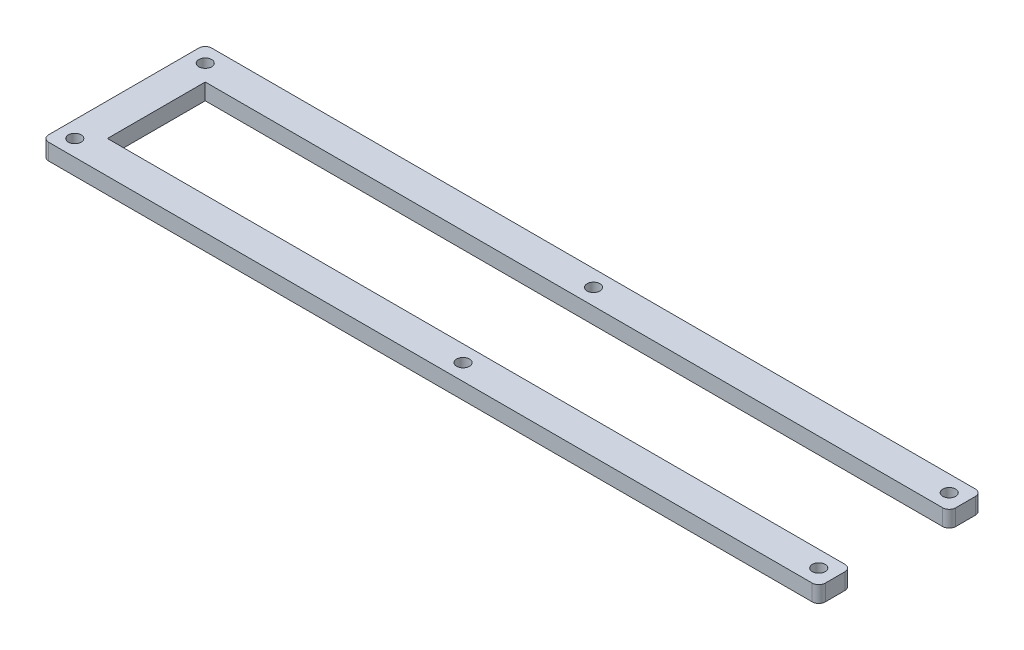
ISO-10303-21;
HEADER;
FILE_DESCRIPTION(('STEP AP214'),'2;1');
FILE_NAME('part.step','',(''),(''),'','','');
FILE_SCHEMA(('AUTOMOTIVE_DESIGN { 1 0 10303 214 1 1 1 1 }'));
ENDSEC;
DATA;
#1=APPLICATION_CONTEXT('core data for automotive mechanical design processes');
#2=APPLICATION_PROTOCOL_DEFINITION('international standard','automotive_design',2000,#1);
#3=PRODUCT_CONTEXT('',#1,'mechanical');
#4=PRODUCT('Part','Part','',(#3));
#5=PRODUCT_RELATED_PRODUCT_CATEGORY('part','',(#4));
#6=PRODUCT_DEFINITION_FORMATION('','',#4);
#7=PRODUCT_DEFINITION_CONTEXT('part definition',#1,'design');
#8=PRODUCT_DEFINITION('design','',#6,#7);
#9=PRODUCT_DEFINITION_SHAPE('','',#8);
#10=(LENGTH_UNIT() NAMED_UNIT(*) SI_UNIT(.MILLI.,.METRE.));
#11=(NAMED_UNIT(*) PLANE_ANGLE_UNIT() SI_UNIT($,.RADIAN.));
#12=(NAMED_UNIT(*) SI_UNIT($,.STERADIAN.) SOLID_ANGLE_UNIT());
#13=UNCERTAINTY_MEASURE_WITH_UNIT(LENGTH_MEASURE(1.E-05),#10,'distance_accuracy_value','');
#14=(GEOMETRIC_REPRESENTATION_CONTEXT(3) GLOBAL_UNCERTAINTY_ASSIGNED_CONTEXT((#13)) GLOBAL_UNIT_ASSIGNED_CONTEXT((#10,
#11,#12)) REPRESENTATION_CONTEXT('',''));
#15=CARTESIAN_POINT('',(0.,0.,0.));
#16=DIRECTION('',(0.,0.,1.));
#17=DIRECTION('',(1.,0.,0.));
#18=AXIS2_PLACEMENT_3D('',#15,#16,#17);
#19=CARTESIAN_POINT('',(0.,6.35,19.05));
#20=DIRECTION('',(0.,0.,-1.));
#21=DIRECTION('',(-1.,0.,0.));
#22=AXIS2_PLACEMENT_3D('',#19,#20,#21);
#23=PLANE('',#22);
#24=DIRECTION('',(1.,0.,0.));
#25=VECTOR('',#24,1.);
#26=CARTESIAN_POINT('',(0.,6.35,19.05));
#27=LINE('',#26,#25);
#28=CARTESIAN_POINT('',(-144.845,6.35,19.05));
#29=VERTEX_POINT('',#28);
#30=CARTESIAN_POINT('',(142.305,6.35,19.05));
#31=VERTEX_POINT('',#30);
#32=EDGE_CURVE('E147',#29,#31,#27,.T.);
#33=ORIENTED_EDGE('',*,*,#32,.T.);
#34=DIRECTION('',(0.,-1.,0.));
#35=VECTOR('',#34,1.);
#36=CARTESIAN_POINT('',(142.305,6.35,19.05));
#37=LINE('',#36,#35);
#38=CARTESIAN_POINT('',(142.305,0.,19.05));
#39=VERTEX_POINT('',#38);
#40=EDGE_CURVE('E279',#31,#39,#37,.T.);
#41=ORIENTED_EDGE('',*,*,#40,.T.);
#42=DIRECTION('',(1.,0.,0.));
#43=VECTOR('',#42,1.);
#44=CARTESIAN_POINT('',(0.,0.,19.05));
#45=LINE('',#44,#43);
#46=CARTESIAN_POINT('',(-144.845,0.,19.05));
#47=VERTEX_POINT('',#46);
#48=EDGE_CURVE('E150',#47,#39,#45,.T.);
#49=ORIENTED_EDGE('',*,*,#48,.F.);
#50=DIRECTION('',(0.,-1.,0.));
#51=VECTOR('',#50,1.);
#52=CARTESIAN_POINT('',(-144.845,6.35,19.05));
#53=LINE('',#52,#51);
#54=EDGE_CURVE('E144',#29,#47,#53,.T.);
#55=ORIENTED_EDGE('',*,*,#54,.F.);
#56=EDGE_LOOP('',(#33,#41,#49,#55));
#57=FACE_BOUND('',#56,.T.);
#58=ADVANCED_FACE('F42',(#57),#23,.T.);
#59=CARTESIAN_POINT('',(-144.845,6.35,0.));
#60=DIRECTION('',(1.,0.,0.));
#61=DIRECTION('',(0.,0.,-1.));
#62=AXIS2_PLACEMENT_3D('',#59,#60,#61);
#63=PLANE('',#62);
#64=DIRECTION('',(0.,0.,1.));
#65=VECTOR('',#64,1.);
#66=CARTESIAN_POINT('',(-144.845,0.,0.));
#67=LINE('',#66,#65);
#68=CARTESIAN_POINT('',(-144.845,0.,-19.05));
#69=VERTEX_POINT('',#68);
#70=EDGE_CURVE('E206',#69,#47,#67,.T.);
#71=ORIENTED_EDGE('',*,*,#70,.F.);
#72=DIRECTION('',(0.,-1.,0.));
#73=VECTOR('',#72,1.);
#74=CARTESIAN_POINT('',(-144.845,6.35,-19.05));
#75=LINE('',#74,#73);
#76=CARTESIAN_POINT('',(-144.845,6.35,-19.05));
#77=VERTEX_POINT('',#76);
#78=EDGE_CURVE('E156',#77,#69,#75,.T.);
#79=ORIENTED_EDGE('',*,*,#78,.F.);
#80=DIRECTION('',(0.,0.,1.));
#81=VECTOR('',#80,1.);
#82=CARTESIAN_POINT('',(-144.845,6.35,0.));
#83=LINE('',#82,#81);
#84=EDGE_CURVE('E163',#77,#29,#83,.T.);
#85=ORIENTED_EDGE('',*,*,#84,.T.);
#86=ORIENTED_EDGE('',*,*,#54,.T.);
#87=EDGE_LOOP('',(#71,#79,#85,#86));
#88=FACE_BOUND('',#87,.T.);
#89=ADVANCED_FACE('F168',(#88),#63,.T.);
#90=CARTESIAN_POINT('',(0.,6.35,-19.05));
#91=DIRECTION('',(0.,0.,-1.));
#92=DIRECTION('',(-1.,0.,0.));
#93=AXIS2_PLACEMENT_3D('',#90,#91,#92);
#94=PLANE('',#93);
#95=DIRECTION('',(1.,0.,0.));
#96=VECTOR('',#95,1.);
#97=CARTESIAN_POINT('',(0.,0.,-19.05));
#98=LINE('',#97,#96);
#99=CARTESIAN_POINT('',(142.305,0.,-19.05));
#100=VERTEX_POINT('',#99);
#101=EDGE_CURVE('E208',#69,#100,#98,.T.);
#102=ORIENTED_EDGE('',*,*,#101,.T.);
#103=DIRECTION('',(0.,-1.,0.));
#104=VECTOR('',#103,1.);
#105=CARTESIAN_POINT('',(142.305,6.35,-19.05));
#106=LINE('',#105,#104);
#107=CARTESIAN_POINT('',(142.305,6.35,-19.05));
#108=VERTEX_POINT('',#107);
#109=EDGE_CURVE('E277',#100,#108,#106,.F.);
#110=ORIENTED_EDGE('',*,*,#109,.T.);
#111=DIRECTION('',(1.,0.,0.));
#112=VECTOR('',#111,1.);
#113=CARTESIAN_POINT('',(0.,6.35,-19.05));
#114=LINE('',#113,#112);
#115=EDGE_CURVE('E170',#77,#108,#114,.T.);
#116=ORIENTED_EDGE('',*,*,#115,.F.);
#117=ORIENTED_EDGE('',*,*,#78,.T.);
#118=EDGE_LOOP('',(#102,#110,#116,#117));
#119=FACE_BOUND('',#118,.T.);
#120=ADVANCED_FACE('F307',(#119),#94,.F.);
#121=CARTESIAN_POINT('',(144.845,6.35,0.));
#122=DIRECTION('',(-1.,0.,0.));
#123=DIRECTION('',(0.,0.,1.));
#124=AXIS2_PLACEMENT_3D('',#121,#122,#123);
#125=PLANE('',#124);
#126=DIRECTION('',(0.,0.,-1.));
#127=VECTOR('',#126,1.);
#128=CARTESIAN_POINT('',(144.845,0.,0.));
#129=LINE('',#128,#127);
#130=CARTESIAN_POINT('',(144.845,0.,-21.59));
#131=VERTEX_POINT('',#130);
#132=CARTESIAN_POINT('',(144.845,0.,-29.21));
#133=VERTEX_POINT('',#132);
#134=EDGE_CURVE('E211',#131,#133,#129,.T.);
#135=ORIENTED_EDGE('',*,*,#134,.T.);
#136=DIRECTION('',(0.,-1.,0.));
#137=VECTOR('',#136,1.);
#138=CARTESIAN_POINT('',(144.845,6.35,-29.21));
#139=LINE('',#138,#137);
#140=CARTESIAN_POINT('',(144.845,6.35,-29.21));
#141=VERTEX_POINT('',#140);
#142=EDGE_CURVE('E275',#133,#141,#139,.F.);
#143=ORIENTED_EDGE('',*,*,#142,.T.);
#144=DIRECTION('',(0.,0.,-1.));
#145=VECTOR('',#144,1.);
#146=CARTESIAN_POINT('',(144.845,6.35,0.));
#147=LINE('',#146,#145);
#148=CARTESIAN_POINT('',(144.845,6.35,-21.59));
#149=VERTEX_POINT('',#148);
#150=EDGE_CURVE('E172',#149,#141,#147,.T.);
#151=ORIENTED_EDGE('',*,*,#150,.F.);
#152=DIRECTION('',(0.,-1.,0.));
#153=VECTOR('',#152,1.);
#154=CARTESIAN_POINT('',(144.845,6.35,-21.59));
#155=LINE('',#154,#153);
#156=EDGE_CURVE('E272',#149,#131,#155,.T.);
#157=ORIENTED_EDGE('',*,*,#156,.T.);
#158=EDGE_LOOP('',(#135,#143,#151,#157));
#159=FACE_BOUND('',#158,.T.);
#160=ADVANCED_FACE('F315',(#159),#125,.F.);
#161=CARTESIAN_POINT('',(0.,6.35,-31.75));
#162=DIRECTION('',(0.,0.,1.));
#163=DIRECTION('',(1.,0.,0.));
#164=AXIS2_PLACEMENT_3D('',#161,#162,#163);
#165=PLANE('',#164);
#166=DIRECTION('',(-1.,0.,0.));
#167=VECTOR('',#166,1.);
#168=CARTESIAN_POINT('',(0.,0.,-31.75));
#169=LINE('',#168,#167);
#170=CARTESIAN_POINT('',(142.305,0.,-31.75));
#171=VERTEX_POINT('',#170);
#172=CARTESIAN_POINT('',(-155.005,0.,-31.75));
#173=VERTEX_POINT('',#172);
#174=EDGE_CURVE('E214',#171,#173,#169,.T.);
#175=ORIENTED_EDGE('',*,*,#174,.T.);
#176=DIRECTION('',(0.,-1.,0.));
#177=VECTOR('',#176,1.);
#178=CARTESIAN_POINT('',(-155.005,6.35,-31.75));
#179=LINE('',#178,#177);
#180=CARTESIAN_POINT('',(-155.005,6.35,-31.75));
#181=VERTEX_POINT('',#180);
#182=EDGE_CURVE('E260',#173,#181,#179,.F.);
#183=ORIENTED_EDGE('',*,*,#182,.T.);
#184=DIRECTION('',(-1.,0.,0.));
#185=VECTOR('',#184,1.);
#186=CARTESIAN_POINT('',(0.,6.35,-31.75));
#187=LINE('',#186,#185);
#188=CARTESIAN_POINT('',(142.305,6.35,-31.75));
#189=VERTEX_POINT('',#188);
#190=EDGE_CURVE('E178',#189,#181,#187,.T.);
#191=ORIENTED_EDGE('',*,*,#190,.F.);
#192=DIRECTION('',(0.,-1.,0.));
#193=VECTOR('',#192,1.);
#194=CARTESIAN_POINT('',(142.305,6.35,-31.75));
#195=LINE('',#194,#193);
#196=EDGE_CURVE('E257',#189,#171,#195,.T.);
#197=ORIENTED_EDGE('',*,*,#196,.T.);
#198=EDGE_LOOP('',(#175,#183,#191,#197));
#199=FACE_BOUND('',#198,.T.);
#200=ADVANCED_FACE('F323',(#199),#165,.F.);
#201=CARTESIAN_POINT('',(-157.545,6.35,0.));
#202=DIRECTION('',(1.,0.,0.));
#203=DIRECTION('',(0.,0.,-1.));
#204=AXIS2_PLACEMENT_3D('',#201,#202,#203);
#205=PLANE('',#204);
#206=DIRECTION('',(0.,0.,1.));
#207=VECTOR('',#206,1.);
#208=CARTESIAN_POINT('',(-157.545,6.35,0.));
#209=LINE('',#208,#207);
#210=CARTESIAN_POINT('',(-157.545,6.35,-29.21));
#211=VERTEX_POINT('',#210);
#212=CARTESIAN_POINT('',(-157.545,6.35,29.21));
#213=VERTEX_POINT('',#212);
#214=EDGE_CURVE('E180',#211,#213,#209,.T.);
#215=ORIENTED_EDGE('',*,*,#214,.F.);
#216=DIRECTION('',(0.,-1.,0.));
#217=VECTOR('',#216,1.);
#218=CARTESIAN_POINT('',(-157.545,6.35,-29.21));
#219=LINE('',#218,#217);
#220=CARTESIAN_POINT('',(-157.545,0.,-29.21));
#221=VERTEX_POINT('',#220);
#222=EDGE_CURVE('E242',#211,#221,#219,.T.);
#223=ORIENTED_EDGE('',*,*,#222,.T.);
#224=DIRECTION('',(0.,0.,1.));
#225=VECTOR('',#224,1.);
#226=CARTESIAN_POINT('',(-157.545,0.,0.));
#227=LINE('',#226,#225);
#228=CARTESIAN_POINT('',(-157.545,0.,29.21));
#229=VERTEX_POINT('',#228);
#230=EDGE_CURVE('E217',#221,#229,#227,.T.);
#231=ORIENTED_EDGE('',*,*,#230,.T.);
#232=DIRECTION('',(0.,-1.,0.));
#233=VECTOR('',#232,1.);
#234=CARTESIAN_POINT('',(-157.545,6.35,29.21));
#235=LINE('',#234,#233);
#236=EDGE_CURVE('E155',#229,#213,#235,.F.);
#237=ORIENTED_EDGE('',*,*,#236,.T.);
#238=EDGE_LOOP('',(#215,#223,#231,#237));
#239=FACE_BOUND('',#238,.T.);
#240=ADVANCED_FACE('F331',(#239),#205,.F.);
#241=CARTESIAN_POINT('',(0.,6.35,31.75));
#242=DIRECTION('',(0.,0.,-1.));
#243=DIRECTION('',(-1.,0.,0.));
#244=AXIS2_PLACEMENT_3D('',#241,#242,#243);
#245=PLANE('',#244);
#246=DIRECTION('',(1.,0.,0.));
#247=VECTOR('',#246,1.);
#248=CARTESIAN_POINT('',(0.,0.,31.75));
#249=LINE('',#248,#247);
#250=CARTESIAN_POINT('',(-155.005,0.,31.75));
#251=VERTEX_POINT('',#250);
#252=CARTESIAN_POINT('',(142.305,0.,31.75));
#253=VERTEX_POINT('',#252);
#254=EDGE_CURVE('E220',#251,#253,#249,.T.);
#255=ORIENTED_EDGE('',*,*,#254,.T.);
#256=DIRECTION('',(0.,-1.,0.));
#257=VECTOR('',#256,1.);
#258=CARTESIAN_POINT('',(142.305,6.35,31.75));
#259=LINE('',#258,#257);
#260=CARTESIAN_POINT('',(142.305,6.35,31.75));
#261=VERTEX_POINT('',#260);
#262=EDGE_CURVE('E11',#253,#261,#259,.F.);
#263=ORIENTED_EDGE('',*,*,#262,.T.);
#264=DIRECTION('',(1.,0.,0.));
#265=VECTOR('',#264,1.);
#266=CARTESIAN_POINT('',(0.,6.35,31.75));
#267=LINE('',#266,#265);
#268=CARTESIAN_POINT('',(-155.005,6.35,31.75));
#269=VERTEX_POINT('',#268);
#270=EDGE_CURVE('E183',#269,#261,#267,.T.);
#271=ORIENTED_EDGE('',*,*,#270,.F.);
#272=DIRECTION('',(0.,-1.,0.));
#273=VECTOR('',#272,1.);
#274=CARTESIAN_POINT('',(-155.005,6.35,31.75));
#275=LINE('',#274,#273);
#276=EDGE_CURVE('E50',#269,#251,#275,.T.);
#277=ORIENTED_EDGE('',*,*,#276,.T.);
#278=EDGE_LOOP('',(#255,#263,#271,#277));
#279=FACE_BOUND('',#278,.T.);
#280=ADVANCED_FACE('F289',(#279),#245,.F.);
#281=CARTESIAN_POINT('',(138.495,6.35,-25.4));
#282=DIRECTION('',(0.,-1.,0.));
#283=DIRECTION('',(0.,0.,-1.));
#284=AXIS2_PLACEMENT_3D('',#281,#282,#283);
#285=CYLINDRICAL_SURFACE('',#284,2.48999999999998);
#286=CARTESIAN_POINT('',(138.495,6.35,-25.4));
#287=DIRECTION('',(0.,1.,0.));
#288=DIRECTION('',(0.,0.,1.));
#289=AXIS2_PLACEMENT_3D('',#286,#287,#288);
#290=CIRCLE('',#289,2.48999999999998);
#291=CARTESIAN_POINT('',(138.495,6.35,-22.91));
#292=VERTEX_POINT('',#291);
#293=EDGE_CURVE('E193',#292,#292,#290,.T.);
#294=ORIENTED_EDGE('',*,*,#293,.T.);
#295=EDGE_LOOP('',(#294));
#296=FACE_BOUND('',#295,.T.);
#297=CARTESIAN_POINT('',(138.495,0.,-25.4));
#298=DIRECTION('',(0.,1.,0.));
#299=DIRECTION('',(0.,0.,1.));
#300=AXIS2_PLACEMENT_3D('',#297,#298,#299);
#301=CIRCLE('',#300,2.48999999999998);
#302=CARTESIAN_POINT('',(138.495,0.,-22.91));
#303=VERTEX_POINT('',#302);
#304=EDGE_CURVE('E233',#303,#303,#301,.T.);
#305=ORIENTED_EDGE('',*,*,#304,.F.);
#306=EDGE_LOOP('',(#305));
#307=FACE_BOUND('',#306,.T.);
#308=ADVANCED_FACE('F435',(#296,#307),#285,.F.);
#309=CARTESIAN_POINT('',(-151.195,6.35,-25.4));
#310=DIRECTION('',(0.,-1.,0.));
#311=DIRECTION('',(0.,0.,-1.));
#312=AXIS2_PLACEMENT_3D('',#309,#310,#311);
#313=CYLINDRICAL_SURFACE('',#312,2.48999999999998);
#314=CARTESIAN_POINT('',(-151.195,6.35,-25.4));
#315=DIRECTION('',(0.,1.,0.));
#316=DIRECTION('',(0.,0.,1.));
#317=AXIS2_PLACEMENT_3D('',#314,#315,#316);
#318=CIRCLE('',#317,2.48999999999998);
#319=CARTESIAN_POINT('',(-151.195,6.35,-22.91));
#320=VERTEX_POINT('',#319);
#321=EDGE_CURVE('E190',#320,#320,#318,.T.);
#322=ORIENTED_EDGE('',*,*,#321,.T.);
#323=EDGE_LOOP('',(#322));
#324=FACE_BOUND('',#323,.T.);
#325=CARTESIAN_POINT('',(-151.195,0.,-25.4));
#326=DIRECTION('',(0.,1.,0.));
#327=DIRECTION('',(0.,0.,1.));
#328=AXIS2_PLACEMENT_3D('',#325,#326,#327);
#329=CIRCLE('',#328,2.48999999999998);
#330=CARTESIAN_POINT('',(-151.195,0.,-22.91));
#331=VERTEX_POINT('',#330);
#332=EDGE_CURVE('E230',#331,#331,#329,.T.);
#333=ORIENTED_EDGE('',*,*,#332,.F.);
#334=EDGE_LOOP('',(#333));
#335=FACE_BOUND('',#334,.T.);
#336=ADVANCED_FACE('F509',(#324,#335),#313,.F.);
#337=CARTESIAN_POINT('',(-151.195,6.35,25.4));
#338=DIRECTION('',(0.,-1.,0.));
#339=DIRECTION('',(0.,0.,-1.));
#340=AXIS2_PLACEMENT_3D('',#337,#338,#339);
#341=CYLINDRICAL_SURFACE('',#340,2.48999999999998);
#342=CARTESIAN_POINT('',(-151.195,6.35,25.4));
#343=DIRECTION('',(0.,1.,0.));
#344=DIRECTION('',(0.,0.,1.));
#345=AXIS2_PLACEMENT_3D('',#342,#343,#344);
#346=CIRCLE('',#345,2.48999999999998);
#347=CARTESIAN_POINT('',(-151.195,6.35,27.89));
#348=VERTEX_POINT('',#347);
#349=EDGE_CURVE('E187',#348,#348,#346,.T.);
#350=ORIENTED_EDGE('',*,*,#349,.T.);
#351=EDGE_LOOP('',(#350));
#352=FACE_BOUND('',#351,.T.);
#353=CARTESIAN_POINT('',(-151.195,0.,25.4));
#354=DIRECTION('',(0.,1.,0.));
#355=DIRECTION('',(0.,0.,1.));
#356=AXIS2_PLACEMENT_3D('',#353,#354,#355);
#357=CIRCLE('',#356,2.48999999999998);
#358=CARTESIAN_POINT('',(-151.195,0.,27.89));
#359=VERTEX_POINT('',#358);
#360=EDGE_CURVE('E227',#359,#359,#357,.T.);
#361=ORIENTED_EDGE('',*,*,#360,.F.);
#362=EDGE_LOOP('',(#361));
#363=FACE_BOUND('',#362,.T.);
#364=ADVANCED_FACE('F422',(#352,#363),#341,.F.);
#365=CARTESIAN_POINT('',(144.845,6.35,0.));
#366=DIRECTION('',(1.,0.,0.));
#367=DIRECTION('',(0.,0.,-1.));
#368=AXIS2_PLACEMENT_3D('',#365,#366,#367);
#369=PLANE('',#368);
#370=DIRECTION('',(0.,0.,1.));
#371=VECTOR('',#370,1.);
#372=CARTESIAN_POINT('',(144.845,0.,0.));
#373=LINE('',#372,#371);
#374=CARTESIAN_POINT('',(144.845,0.,21.59));
#375=VERTEX_POINT('',#374);
#376=CARTESIAN_POINT('',(144.845,0.,29.21));
#377=VERTEX_POINT('',#376);
#378=EDGE_CURVE('E224',#375,#377,#373,.T.);
#379=ORIENTED_EDGE('',*,*,#378,.F.);
#380=DIRECTION('',(0.,-1.,0.));
#381=VECTOR('',#380,1.);
#382=CARTESIAN_POINT('',(144.845,6.35,21.59));
#383=LINE('',#382,#381);
#384=CARTESIAN_POINT('',(144.845,6.35,21.59));
#385=VERTEX_POINT('',#384);
#386=EDGE_CURVE('E64',#375,#385,#383,.F.);
#387=ORIENTED_EDGE('',*,*,#386,.T.);
#388=DIRECTION('',(0.,0.,1.));
#389=VECTOR('',#388,1.);
#390=CARTESIAN_POINT('',(144.845,6.35,0.));
#391=LINE('',#390,#389);
#392=CARTESIAN_POINT('',(144.845,6.35,29.21));
#393=VERTEX_POINT('',#392);
#394=EDGE_CURVE('E185',#385,#393,#391,.T.);
#395=ORIENTED_EDGE('',*,*,#394,.T.);
#396=DIRECTION('',(0.,-1.,0.));
#397=VECTOR('',#396,1.);
#398=CARTESIAN_POINT('',(144.845,0.,29.21));
#399=LINE('',#398,#397);
#400=EDGE_CURVE('E281',#393,#377,#399,.T.);
#401=ORIENTED_EDGE('',*,*,#400,.T.);
#402=EDGE_LOOP('',(#379,#387,#395,#401));
#403=FACE_BOUND('',#402,.T.);
#404=ADVANCED_FACE('F300',(#403),#369,.T.);
#405=CARTESIAN_POINT('',(0.,6.35,25.4));
#406=DIRECTION('',(0.,-1.,0.));
#407=DIRECTION('',(0.,0.,-1.));
#408=AXIS2_PLACEMENT_3D('',#405,#406,#407);
#409=CYLINDRICAL_SURFACE('',#408,2.48999999999971);
#410=CARTESIAN_POINT('',(0.,6.35,25.4));
#411=DIRECTION('',(0.,1.,0.));
#412=DIRECTION('',(0.,0.,1.));
#413=AXIS2_PLACEMENT_3D('',#410,#411,#412);
#414=CIRCLE('',#413,2.48999999999971);
#415=CARTESIAN_POINT('',(0.,6.35,27.8899999999997));
#416=VERTEX_POINT('',#415);
#417=EDGE_CURVE('E166',#416,#416,#414,.T.);
#418=ORIENTED_EDGE('',*,*,#417,.T.);
#419=EDGE_LOOP('',(#418));
#420=FACE_BOUND('',#419,.T.);
#421=CARTESIAN_POINT('',(0.,0.,25.4));
#422=DIRECTION('',(0.,1.,0.));
#423=DIRECTION('',(0.,0.,1.));
#424=AXIS2_PLACEMENT_3D('',#421,#422,#423);
#425=CIRCLE('',#424,2.48999999999971);
#426=CARTESIAN_POINT('',(0.,0.,27.8899999999997));
#427=VERTEX_POINT('',#426);
#428=EDGE_CURVE('E202',#427,#427,#425,.T.);
#429=ORIENTED_EDGE('',*,*,#428,.F.);
#430=EDGE_LOOP('',(#429));
#431=FACE_BOUND('',#430,.T.);
#432=ADVANCED_FACE('F345',(#420,#431),#409,.F.);
#433=CARTESIAN_POINT('',(138.495,6.35,25.4));
#434=DIRECTION('',(0.,-1.,0.));
#435=DIRECTION('',(0.,0.,-1.));
#436=AXIS2_PLACEMENT_3D('',#433,#434,#435);
#437=CYLINDRICAL_SURFACE('',#436,2.48999999999998);
#438=CARTESIAN_POINT('',(138.495,6.35,25.4));
#439=DIRECTION('',(0.,1.,0.));
#440=DIRECTION('',(0.,0.,1.));
#441=AXIS2_PLACEMENT_3D('',#438,#439,#440);
#442=CIRCLE('',#441,2.48999999999998);
#443=CARTESIAN_POINT('',(138.495,6.35,27.89));
#444=VERTEX_POINT('',#443);
#445=EDGE_CURVE('E239',#444,#444,#442,.T.);
#446=ORIENTED_EDGE('',*,*,#445,.T.);
#447=EDGE_LOOP('',(#446));
#448=FACE_BOUND('',#447,.T.);
#449=CARTESIAN_POINT('',(138.495,0.,25.4));
#450=DIRECTION('',(0.,1.,0.));
#451=DIRECTION('',(0.,0.,1.));
#452=AXIS2_PLACEMENT_3D('',#449,#450,#451);
#453=CIRCLE('',#452,2.48999999999998);
#454=CARTESIAN_POINT('',(138.495,0.,27.89));
#455=VERTEX_POINT('',#454);
#456=EDGE_CURVE('E199',#455,#455,#453,.T.);
#457=ORIENTED_EDGE('',*,*,#456,.F.);
#458=EDGE_LOOP('',(#457));
#459=FACE_BOUND('',#458,.T.);
#460=ADVANCED_FACE('F348',(#448,#459),#437,.F.);
#461=CARTESIAN_POINT('',(0.,6.35,-25.4));
#462=DIRECTION('',(0.,-1.,0.));
#463=DIRECTION('',(0.,0.,-1.));
#464=AXIS2_PLACEMENT_3D('',#461,#462,#463);
#465=CYLINDRICAL_SURFACE('',#464,2.49);
#466=CARTESIAN_POINT('',(0.,6.35,-25.4));
#467=DIRECTION('',(0.,1.,0.));
#468=DIRECTION('',(0.,0.,1.));
#469=AXIS2_PLACEMENT_3D('',#466,#467,#468);
#470=CIRCLE('',#469,2.49);
#471=CARTESIAN_POINT('',(0.,6.35,-22.91));
#472=VERTEX_POINT('',#471);
#473=EDGE_CURVE('E196',#472,#472,#470,.T.);
#474=ORIENTED_EDGE('',*,*,#473,.T.);
#475=EDGE_LOOP('',(#474));
#476=FACE_BOUND('',#475,.T.);
#477=CARTESIAN_POINT('',(0.,0.,-25.4));
#478=DIRECTION('',(0.,1.,0.));
#479=DIRECTION('',(0.,0.,1.));
#480=AXIS2_PLACEMENT_3D('',#477,#478,#479);
#481=CIRCLE('',#480,2.49);
#482=CARTESIAN_POINT('',(0.,0.,-22.91));
#483=VERTEX_POINT('',#482);
#484=EDGE_CURVE('E236',#483,#483,#481,.T.);
#485=ORIENTED_EDGE('',*,*,#484,.F.);
#486=EDGE_LOOP('',(#485));
#487=FACE_BOUND('',#486,.T.);
#488=ADVANCED_FACE('F352',(#476,#487),#465,.F.);
#489=CARTESIAN_POINT('',(0.,6.35,0.));
#490=DIRECTION('',(0.,1.,0.));
#491=DIRECTION('',(0.,0.,1.));
#492=AXIS2_PLACEMENT_3D('',#489,#490,#491);
#493=PLANE('',#492);
#494=ORIENTED_EDGE('',*,*,#445,.F.);
#495=EDGE_LOOP('',(#494));
#496=FACE_BOUND('',#495,.T.);
#497=ORIENTED_EDGE('',*,*,#417,.F.);
#498=EDGE_LOOP('',(#497));
#499=FACE_BOUND('',#498,.T.);
#500=ORIENTED_EDGE('',*,*,#190,.T.);
#501=CARTESIAN_POINT('',(-155.005,6.35,-29.21));
#502=DIRECTION('',(0.,1.,0.));
#503=DIRECTION('',(0.,0.,1.));
#504=AXIS2_PLACEMENT_3D('',#501,#502,#503);
#505=CIRCLE('',#504,2.54);
#506=EDGE_CURVE('E270',#181,#211,#505,.T.);
#507=ORIENTED_EDGE('',*,*,#506,.T.);
#508=ORIENTED_EDGE('',*,*,#214,.T.);
#509=CARTESIAN_POINT('',(-155.005,6.35,29.21));
#510=DIRECTION('',(0.,1.,0.));
#511=DIRECTION('',(0.,0.,1.));
#512=AXIS2_PLACEMENT_3D('',#509,#510,#511);
#513=CIRCLE('',#512,2.54);
#514=EDGE_CURVE('E262',#213,#269,#513,.T.);
#515=ORIENTED_EDGE('',*,*,#514,.T.);
#516=ORIENTED_EDGE('',*,*,#270,.T.);
#517=CARTESIAN_POINT('',(142.305,6.35,29.21));
#518=DIRECTION('',(0.,1.,0.));
#519=DIRECTION('',(0.,0.,1.));
#520=AXIS2_PLACEMENT_3D('',#517,#518,#519);
#521=CIRCLE('',#520,2.54);
#522=EDGE_CURVE('E57',#261,#393,#521,.T.);
#523=ORIENTED_EDGE('',*,*,#522,.T.);
#524=ORIENTED_EDGE('',*,*,#394,.F.);
#525=CARTESIAN_POINT('',(142.305,6.35,21.59));
#526=DIRECTION('',(0.,1.,0.));
#527=DIRECTION('',(0.,0.,1.));
#528=AXIS2_PLACEMENT_3D('',#525,#526,#527);
#529=CIRCLE('',#528,2.54);
#530=EDGE_CURVE('E165',#385,#31,#529,.T.);
#531=ORIENTED_EDGE('',*,*,#530,.T.);
#532=ORIENTED_EDGE('',*,*,#32,.F.);
#533=ORIENTED_EDGE('',*,*,#84,.F.);
#534=ORIENTED_EDGE('',*,*,#115,.T.);
#535=CARTESIAN_POINT('',(142.305,6.35,-21.59));
#536=DIRECTION('',(0.,1.,0.));
#537=DIRECTION('',(0.,0.,1.));
#538=AXIS2_PLACEMENT_3D('',#535,#536,#537);
#539=CIRCLE('',#538,2.54);
#540=EDGE_CURVE('E266',#108,#149,#539,.T.);
#541=ORIENTED_EDGE('',*,*,#540,.T.);
#542=ORIENTED_EDGE('',*,*,#150,.T.);
#543=CARTESIAN_POINT('',(142.305,6.35,-29.21));
#544=DIRECTION('',(0.,1.,0.));
#545=DIRECTION('',(0.,0.,1.));
#546=AXIS2_PLACEMENT_3D('',#543,#544,#545);
#547=CIRCLE('',#546,2.54);
#548=EDGE_CURVE('E268',#141,#189,#547,.T.);
#549=ORIENTED_EDGE('',*,*,#548,.T.);
#550=EDGE_LOOP('',(#500,#507,#508,#515,#516,#523,#524,#531,#532,#533,#534,#541,#542,#549));
#551=FACE_BOUND('',#550,.T.);
#552=ORIENTED_EDGE('',*,*,#349,.F.);
#553=EDGE_LOOP('',(#552));
#554=FACE_BOUND('',#553,.T.);
#555=ORIENTED_EDGE('',*,*,#321,.F.);
#556=EDGE_LOOP('',(#555));
#557=FACE_BOUND('',#556,.T.);
#558=ORIENTED_EDGE('',*,*,#293,.F.);
#559=EDGE_LOOP('',(#558));
#560=FACE_BOUND('',#559,.T.);
#561=ORIENTED_EDGE('',*,*,#473,.F.);
#562=EDGE_LOOP('',(#561));
#563=FACE_BOUND('',#562,.T.);
#564=ADVANCED_FACE('F160',(#496,#499,#551,#554,#557,#560,#563),#493,.T.);
#565=CARTESIAN_POINT('',(0.,0.,0.));
#566=DIRECTION('',(0.,1.,0.));
#567=DIRECTION('',(0.,0.,1.));
#568=AXIS2_PLACEMENT_3D('',#565,#566,#567);
#569=PLANE('',#568);
#570=ORIENTED_EDGE('',*,*,#456,.T.);
#571=EDGE_LOOP('',(#570));
#572=FACE_BOUND('',#571,.T.);
#573=ORIENTED_EDGE('',*,*,#428,.T.);
#574=EDGE_LOOP('',(#573));
#575=FACE_BOUND('',#574,.T.);
#576=ORIENTED_EDGE('',*,*,#230,.F.);
#577=CARTESIAN_POINT('',(-155.005,0.,-29.21));
#578=DIRECTION('',(0.,1.,0.));
#579=DIRECTION('',(0.,0.,1.));
#580=AXIS2_PLACEMENT_3D('',#577,#578,#579);
#581=CIRCLE('',#580,2.54);
#582=EDGE_CURVE('E255',#221,#173,#581,.F.);
#583=ORIENTED_EDGE('',*,*,#582,.T.);
#584=ORIENTED_EDGE('',*,*,#174,.F.);
#585=CARTESIAN_POINT('',(142.305,0.,-29.21));
#586=DIRECTION('',(0.,1.,0.));
#587=DIRECTION('',(0.,0.,1.));
#588=AXIS2_PLACEMENT_3D('',#585,#586,#587);
#589=CIRCLE('',#588,2.54);
#590=EDGE_CURVE('E253',#171,#133,#589,.F.);
#591=ORIENTED_EDGE('',*,*,#590,.T.);
#592=ORIENTED_EDGE('',*,*,#134,.F.);
#593=CARTESIAN_POINT('',(142.305,0.,-21.59));
#594=DIRECTION('',(0.,1.,0.));
#595=DIRECTION('',(0.,0.,1.));
#596=AXIS2_PLACEMENT_3D('',#593,#594,#595);
#597=CIRCLE('',#596,2.54);
#598=EDGE_CURVE('E251',#131,#100,#597,.F.);
#599=ORIENTED_EDGE('',*,*,#598,.T.);
#600=ORIENTED_EDGE('',*,*,#101,.F.);
#601=ORIENTED_EDGE('',*,*,#70,.T.);
#602=ORIENTED_EDGE('',*,*,#48,.T.);
#603=CARTESIAN_POINT('',(142.305,0.,21.59));
#604=DIRECTION('',(0.,1.,0.));
#605=DIRECTION('',(0.,0.,1.));
#606=AXIS2_PLACEMENT_3D('',#603,#604,#605);
#607=CIRCLE('',#606,2.54);
#608=EDGE_CURVE('E249',#39,#375,#607,.F.);
#609=ORIENTED_EDGE('',*,*,#608,.T.);
#610=ORIENTED_EDGE('',*,*,#378,.T.);
#611=CARTESIAN_POINT('',(142.305,0.,29.21));
#612=DIRECTION('',(0.,1.,0.));
#613=DIRECTION('',(0.,0.,1.));
#614=AXIS2_PLACEMENT_3D('',#611,#612,#613);
#615=CIRCLE('',#614,2.54);
#616=EDGE_CURVE('E247',#377,#253,#615,.F.);
#617=ORIENTED_EDGE('',*,*,#616,.T.);
#618=ORIENTED_EDGE('',*,*,#254,.F.);
#619=CARTESIAN_POINT('',(-155.005,0.,29.21));
#620=DIRECTION('',(0.,1.,0.));
#621=DIRECTION('',(0.,0.,1.));
#622=AXIS2_PLACEMENT_3D('',#619,#620,#621);
#623=CIRCLE('',#622,2.54);
#624=EDGE_CURVE('E245',#251,#229,#623,.F.);
#625=ORIENTED_EDGE('',*,*,#624,.T.);
#626=EDGE_LOOP('',(#576,#583,#584,#591,#592,#599,#600,#601,#602,#609,#610,#617,#618,#625));
#627=FACE_BOUND('',#626,.T.);
#628=ORIENTED_EDGE('',*,*,#360,.T.);
#629=EDGE_LOOP('',(#628));
#630=FACE_BOUND('',#629,.T.);
#631=ORIENTED_EDGE('',*,*,#332,.T.);
#632=EDGE_LOOP('',(#631));
#633=FACE_BOUND('',#632,.T.);
#634=ORIENTED_EDGE('',*,*,#304,.T.);
#635=EDGE_LOOP('',(#634));
#636=FACE_BOUND('',#635,.T.);
#637=ORIENTED_EDGE('',*,*,#484,.T.);
#638=EDGE_LOOP('',(#637));
#639=FACE_BOUND('',#638,.T.);
#640=ADVANCED_FACE('F295',(#572,#575,#627,#630,#633,#636,#639),#569,.F.);
#641=CARTESIAN_POINT('',(-155.005,6.35,-29.21));
#642=DIRECTION('',(0.,-1.,0.));
#643=DIRECTION('',(0.,0.,-1.));
#644=AXIS2_PLACEMENT_3D('',#641,#642,#643);
#645=CYLINDRICAL_SURFACE('',#644,2.54);
#646=ORIENTED_EDGE('',*,*,#506,.F.);
#647=ORIENTED_EDGE('',*,*,#182,.F.);
#648=ORIENTED_EDGE('',*,*,#582,.F.);
#649=ORIENTED_EDGE('',*,*,#222,.F.);
#650=EDGE_LOOP('',(#646,#647,#648,#649));
#651=FACE_BOUND('',#650,.T.);
#652=ADVANCED_FACE('F327',(#651),#645,.T.);
#653=CARTESIAN_POINT('',(142.305,6.35,-29.21));
#654=DIRECTION('',(0.,-1.,0.));
#655=DIRECTION('',(0.,0.,-1.));
#656=AXIS2_PLACEMENT_3D('',#653,#654,#655);
#657=CYLINDRICAL_SURFACE('',#656,2.54);
#658=ORIENTED_EDGE('',*,*,#548,.F.);
#659=ORIENTED_EDGE('',*,*,#142,.F.);
#660=ORIENTED_EDGE('',*,*,#590,.F.);
#661=ORIENTED_EDGE('',*,*,#196,.F.);
#662=EDGE_LOOP('',(#658,#659,#660,#661));
#663=FACE_BOUND('',#662,.T.);
#664=ADVANCED_FACE('F318',(#663),#657,.T.);
#665=CARTESIAN_POINT('',(142.305,6.35,-21.59));
#666=DIRECTION('',(0.,-1.,0.));
#667=DIRECTION('',(0.,0.,-1.));
#668=AXIS2_PLACEMENT_3D('',#665,#666,#667);
#669=CYLINDRICAL_SURFACE('',#668,2.54);
#670=ORIENTED_EDGE('',*,*,#540,.F.);
#671=ORIENTED_EDGE('',*,*,#109,.F.);
#672=ORIENTED_EDGE('',*,*,#598,.F.);
#673=ORIENTED_EDGE('',*,*,#156,.F.);
#674=EDGE_LOOP('',(#670,#671,#672,#673));
#675=FACE_BOUND('',#674,.T.);
#676=ADVANCED_FACE('F310',(#675),#669,.T.);
#677=CARTESIAN_POINT('',(142.305,6.35,21.59));
#678=DIRECTION('',(0.,-1.,0.));
#679=DIRECTION('',(0.,0.,-1.));
#680=AXIS2_PLACEMENT_3D('',#677,#678,#679);
#681=CYLINDRICAL_SURFACE('',#680,2.54);
#682=ORIENTED_EDGE('',*,*,#530,.F.);
#683=ORIENTED_EDGE('',*,*,#386,.F.);
#684=ORIENTED_EDGE('',*,*,#608,.F.);
#685=ORIENTED_EDGE('',*,*,#40,.F.);
#686=EDGE_LOOP('',(#682,#683,#684,#685));
#687=FACE_BOUND('',#686,.T.);
#688=ADVANCED_FACE('F302',(#687),#681,.T.);
#689=CARTESIAN_POINT('',(142.305,6.35,29.21));
#690=DIRECTION('',(0.,1.,0.));
#691=DIRECTION('',(0.,0.,1.));
#692=AXIS2_PLACEMENT_3D('',#689,#690,#691);
#693=CYLINDRICAL_SURFACE('',#692,2.54);
#694=ORIENTED_EDGE('',*,*,#522,.F.);
#695=ORIENTED_EDGE('',*,*,#262,.F.);
#696=ORIENTED_EDGE('',*,*,#616,.F.);
#697=ORIENTED_EDGE('',*,*,#400,.F.);
#698=EDGE_LOOP('',(#694,#695,#696,#697));
#699=FACE_BOUND('',#698,.T.);
#700=ADVANCED_FACE('F299',(#699),#693,.T.);
#701=CARTESIAN_POINT('',(-155.005,6.35,29.21));
#702=DIRECTION('',(0.,-1.,0.));
#703=DIRECTION('',(0.,0.,-1.));
#704=AXIS2_PLACEMENT_3D('',#701,#702,#703);
#705=CYLINDRICAL_SURFACE('',#704,2.54);
#706=ORIENTED_EDGE('',*,*,#514,.F.);
#707=ORIENTED_EDGE('',*,*,#236,.F.);
#708=ORIENTED_EDGE('',*,*,#624,.F.);
#709=ORIENTED_EDGE('',*,*,#276,.F.);
#710=EDGE_LOOP('',(#706,#707,#708,#709));
#711=FACE_BOUND('',#710,.T.);
#712=ADVANCED_FACE('F44',(#711),#705,.T.);
#713=CLOSED_SHELL('',(#58,#89,#120,#160,#200,#240,#280,#308,#336,#364,#404,#432,#460,#488,#564,
#640,#652,#664,#676,#688,#700,#712));
#714=MANIFOLD_SOLID_BREP('B2',#713);
#715=ADVANCED_BREP_SHAPE_REPRESENTATION('',(#18,#714),#14);
#716=SHAPE_DEFINITION_REPRESENTATION(#9,#715);
ENDSEC;
END-ISO-10303-21;
